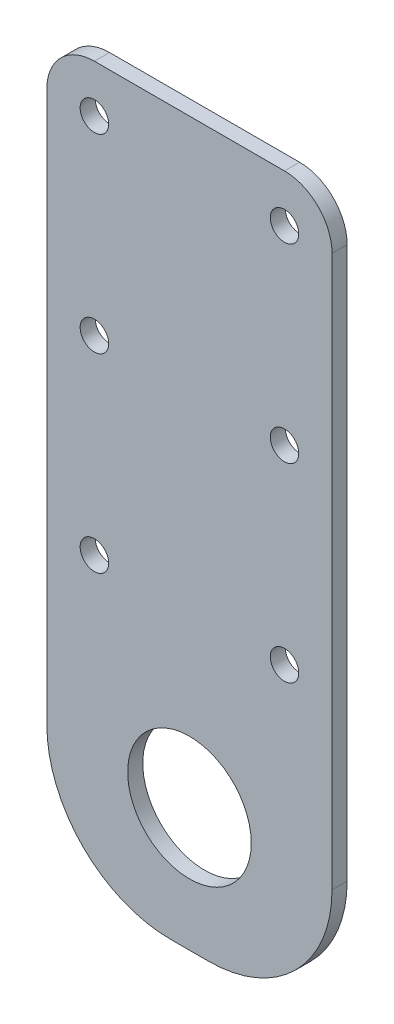
ISO-10303-21;
HEADER;
FILE_DESCRIPTION(('STEP AP214'),'2;1');
FILE_NAME('part.step','',(''),(''),'','','');
FILE_SCHEMA(('AUTOMOTIVE_DESIGN { 1 0 10303 214 1 1 1 1 }'));
ENDSEC;
DATA;
#1=APPLICATION_CONTEXT('core data for automotive mechanical design processes');
#2=APPLICATION_PROTOCOL_DEFINITION('international standard','automotive_design',2000,#1);
#3=PRODUCT_CONTEXT('',#1,'mechanical');
#4=PRODUCT('Part','Part','',(#3));
#5=PRODUCT_RELATED_PRODUCT_CATEGORY('part','',(#4));
#6=PRODUCT_DEFINITION_FORMATION('','',#4);
#7=PRODUCT_DEFINITION_CONTEXT('part definition',#1,'design');
#8=PRODUCT_DEFINITION('design','',#6,#7);
#9=PRODUCT_DEFINITION_SHAPE('','',#8);
#10=(LENGTH_UNIT() NAMED_UNIT(*) SI_UNIT(.MILLI.,.METRE.));
#11=(NAMED_UNIT(*) PLANE_ANGLE_UNIT() SI_UNIT($,.RADIAN.));
#12=(NAMED_UNIT(*) SI_UNIT($,.STERADIAN.) SOLID_ANGLE_UNIT());
#13=UNCERTAINTY_MEASURE_WITH_UNIT(LENGTH_MEASURE(1.E-05),#10,'distance_accuracy_value','');
#14=(GEOMETRIC_REPRESENTATION_CONTEXT(3) GLOBAL_UNCERTAINTY_ASSIGNED_CONTEXT((#13)) GLOBAL_UNIT_ASSIGNED_CONTEXT((#10,
#11,#12)) REPRESENTATION_CONTEXT('',''));
#15=CARTESIAN_POINT('',(0.,0.,0.));
#16=DIRECTION('',(0.,0.,1.));
#17=DIRECTION('',(1.,0.,0.));
#18=AXIS2_PLACEMENT_3D('',#15,#16,#17);
#19=CARTESIAN_POINT('',(0.,0.,1.5875));
#20=DIRECTION('',(0.,0.,1.));
#21=DIRECTION('',(1.,0.,0.));
#22=AXIS2_PLACEMENT_3D('',#19,#20,#21);
#23=PLANE('',#22);
#24=CARTESIAN_POINT('',(25.,25.,1.5875));
#25=DIRECTION('',(0.,0.,1.));
#26=DIRECTION('',(-1.,0.,0.));
#27=AXIS2_PLACEMENT_3D('',#24,#25,#26);
#28=CIRCLE('',#27,1.5);
#29=CARTESIAN_POINT('',(23.5,25.,1.5875));
#30=VERTEX_POINT('',#29);
#31=EDGE_CURVE('E206',#30,#30,#28,.T.);
#32=ORIENTED_EDGE('',*,*,#31,.F.);
#33=EDGE_LOOP('',(#32));
#34=FACE_BOUND('',#33,.T.);
#35=CARTESIAN_POINT('',(5.00000000000001,5.,1.5875));
#36=DIRECTION('',(0.,0.,1.));
#37=DIRECTION('',(1.,0.,0.));
#38=AXIS2_PLACEMENT_3D('',#35,#36,#37);
#39=CIRCLE('',#38,1.5);
#40=CARTESIAN_POINT('',(6.50000000000001,5.,1.5875));
#41=VERTEX_POINT('',#40);
#42=EDGE_CURVE('E194',#41,#41,#39,.T.);
#43=ORIENTED_EDGE('',*,*,#42,.F.);
#44=EDGE_LOOP('',(#43));
#45=FACE_BOUND('',#44,.T.);
#46=CARTESIAN_POINT('',(5.,45.,1.5875));
#47=DIRECTION('',(0.,0.,1.));
#48=DIRECTION('',(1.,0.,0.));
#49=AXIS2_PLACEMENT_3D('',#46,#47,#48);
#50=CIRCLE('',#49,1.5);
#51=CARTESIAN_POINT('',(6.5,45.,1.5875));
#52=VERTEX_POINT('',#51);
#53=EDGE_CURVE('E183',#52,#52,#50,.T.);
#54=ORIENTED_EDGE('',*,*,#53,.F.);
#55=EDGE_LOOP('',(#54));
#56=FACE_BOUND('',#55,.T.);
#57=DIRECTION('',(1.,0.,0.));
#58=VECTOR('',#57,1.);
#59=CARTESIAN_POINT('',(0.,-26.,1.5875));
#60=LINE('',#59,#58);
#61=CARTESIAN_POINT('',(13.,-26.,1.5875));
#62=VERTEX_POINT('',#61);
#63=CARTESIAN_POINT('',(17.,-26.,1.5875));
#64=VERTEX_POINT('',#63);
#65=EDGE_CURVE('E128',#62,#64,#60,.T.);
#66=ORIENTED_EDGE('',*,*,#65,.T.);
#67=CARTESIAN_POINT('',(17.,-13.,1.5875));
#68=DIRECTION('',(0.,0.,1.));
#69=DIRECTION('',(1.,0.,0.));
#70=AXIS2_PLACEMENT_3D('',#67,#68,#69);
#71=CIRCLE('',#70,13.);
#72=CARTESIAN_POINT('',(30.,-13.,1.5875));
#73=VERTEX_POINT('',#72);
#74=EDGE_CURVE('E44',#64,#73,#71,.T.);
#75=ORIENTED_EDGE('',*,*,#74,.T.);
#76=DIRECTION('',(0.,1.,0.));
#77=VECTOR('',#76,1.);
#78=CARTESIAN_POINT('',(30.,-26.,1.5875));
#79=LINE('',#78,#77);
#80=CARTESIAN_POINT('',(30.,45.,1.5875));
#81=VERTEX_POINT('',#80);
#82=EDGE_CURVE('E161',#73,#81,#79,.T.);
#83=ORIENTED_EDGE('',*,*,#82,.T.);
#84=CARTESIAN_POINT('',(25.,45.,1.5875));
#85=DIRECTION('',(0.,0.,1.));
#86=DIRECTION('',(1.,0.,0.));
#87=AXIS2_PLACEMENT_3D('',#84,#85,#86);
#88=CIRCLE('',#87,5.);
#89=CARTESIAN_POINT('',(25.,50.,1.5875));
#90=VERTEX_POINT('',#89);
#91=EDGE_CURVE('E139',#81,#90,#88,.T.);
#92=ORIENTED_EDGE('',*,*,#91,.T.);
#93=DIRECTION('',(-1.,0.,0.));
#94=VECTOR('',#93,1.);
#95=CARTESIAN_POINT('',(0.,50.,1.5875));
#96=LINE('',#95,#94);
#97=CARTESIAN_POINT('',(5.,50.,1.5875));
#98=VERTEX_POINT('',#97);
#99=EDGE_CURVE('E119',#90,#98,#96,.T.);
#100=ORIENTED_EDGE('',*,*,#99,.T.);
#101=CARTESIAN_POINT('',(5.,45.,1.5875));
#102=DIRECTION('',(0.,0.,1.));
#103=DIRECTION('',(1.,0.,0.));
#104=AXIS2_PLACEMENT_3D('',#101,#102,#103);
#105=CIRCLE('',#104,5.);
#106=CARTESIAN_POINT('',(0.,45.,1.5875));
#107=VERTEX_POINT('',#106);
#108=EDGE_CURVE('E141',#98,#107,#105,.T.);
#109=ORIENTED_EDGE('',*,*,#108,.T.);
#110=DIRECTION('',(0.,-1.,0.));
#111=VECTOR('',#110,1.);
#112=CARTESIAN_POINT('',(0.,0.,1.5875));
#113=LINE('',#112,#111);
#114=CARTESIAN_POINT('',(0.,-13.,1.5875));
#115=VERTEX_POINT('',#114);
#116=EDGE_CURVE('E118',#107,#115,#113,.T.);
#117=ORIENTED_EDGE('',*,*,#116,.T.);
#118=CARTESIAN_POINT('',(13.,-13.,1.5875));
#119=DIRECTION('',(0.,0.,1.));
#120=DIRECTION('',(1.,0.,0.));
#121=AXIS2_PLACEMENT_3D('',#118,#119,#120);
#122=CIRCLE('',#121,13.);
#123=EDGE_CURVE('E156',#115,#62,#122,.T.);
#124=ORIENTED_EDGE('',*,*,#123,.T.);
#125=EDGE_LOOP('',(#66,#75,#83,#92,#100,#109,#117,#124));
#126=FACE_BOUND('',#125,.T.);
#127=CARTESIAN_POINT('',(15.,-13.,1.5875));
#128=DIRECTION('',(0.,0.,1.));
#129=DIRECTION('',(1.,0.,0.));
#130=AXIS2_PLACEMENT_3D('',#127,#128,#129);
#131=CIRCLE('',#130,6.50000000000001);
#132=CARTESIAN_POINT('',(21.5,-13.,1.5875));
#133=VERTEX_POINT('',#132);
#134=EDGE_CURVE('E173',#133,#133,#131,.T.);
#135=ORIENTED_EDGE('',*,*,#134,.F.);
#136=EDGE_LOOP('',(#135));
#137=FACE_BOUND('',#136,.T.);
#138=CARTESIAN_POINT('',(5.,25.,1.5875));
#139=DIRECTION('',(0.,0.,1.));
#140=DIRECTION('',(1.,0.,0.));
#141=AXIS2_PLACEMENT_3D('',#138,#139,#140);
#142=CIRCLE('',#141,1.5);
#143=CARTESIAN_POINT('',(6.5,25.,1.5875));
#144=VERTEX_POINT('',#143);
#145=EDGE_CURVE('E188',#144,#144,#142,.T.);
#146=ORIENTED_EDGE('',*,*,#145,.F.);
#147=EDGE_LOOP('',(#146));
#148=FACE_BOUND('',#147,.T.);
#149=CARTESIAN_POINT('',(25.,5.,1.5875));
#150=DIRECTION('',(0.,0.,1.));
#151=DIRECTION('',(-1.,0.,0.));
#152=AXIS2_PLACEMENT_3D('',#149,#150,#151);
#153=CIRCLE('',#152,1.5);
#154=CARTESIAN_POINT('',(23.5,5.,1.5875));
#155=VERTEX_POINT('',#154);
#156=EDGE_CURVE('E200',#155,#155,#153,.T.);
#157=ORIENTED_EDGE('',*,*,#156,.F.);
#158=EDGE_LOOP('',(#157));
#159=FACE_BOUND('',#158,.T.);
#160=CARTESIAN_POINT('',(25.,45.,1.5875));
#161=DIRECTION('',(0.,0.,1.));
#162=DIRECTION('',(-1.,0.,0.));
#163=AXIS2_PLACEMENT_3D('',#160,#161,#162);
#164=CIRCLE('',#163,1.5);
#165=CARTESIAN_POINT('',(23.5,45.,1.5875));
#166=VERTEX_POINT('',#165);
#167=EDGE_CURVE('E212',#166,#166,#164,.T.);
#168=ORIENTED_EDGE('',*,*,#167,.F.);
#169=EDGE_LOOP('',(#168));
#170=FACE_BOUND('',#169,.T.);
#171=ADVANCED_FACE('F36',(#34,#45,#56,#126,#137,#148,#159,#170),#23,.T.);
#172=CARTESIAN_POINT('',(0.,0.,0.));
#173=DIRECTION('',(0.,0.,1.));
#174=DIRECTION('',(1.,0.,0.));
#175=AXIS2_PLACEMENT_3D('',#172,#173,#174);
#176=PLANE('',#175);
#177=DIRECTION('',(0.,1.,0.));
#178=VECTOR('',#177,1.);
#179=CARTESIAN_POINT('',(30.,50.,0.));
#180=LINE('',#179,#178);
#181=CARTESIAN_POINT('',(30.,-13.,0.));
#182=VERTEX_POINT('',#181);
#183=CARTESIAN_POINT('',(30.,45.,0.));
#184=VERTEX_POINT('',#183);
#185=EDGE_CURVE('E130',#182,#184,#180,.T.);
#186=ORIENTED_EDGE('',*,*,#185,.F.);
#187=CARTESIAN_POINT('',(17.,-13.,0.));
#188=DIRECTION('',(0.,0.,1.));
#189=DIRECTION('',(1.,0.,0.));
#190=AXIS2_PLACEMENT_3D('',#187,#188,#189);
#191=CIRCLE('',#190,13.);
#192=CARTESIAN_POINT('',(17.,-26.,0.));
#193=VERTEX_POINT('',#192);
#194=EDGE_CURVE('E150',#182,#193,#191,.F.);
#195=ORIENTED_EDGE('',*,*,#194,.T.);
#196=DIRECTION('',(1.,0.,0.));
#197=VECTOR('',#196,1.);
#198=CARTESIAN_POINT('',(0.,-26.,0.));
#199=LINE('',#198,#197);
#200=CARTESIAN_POINT('',(13.,-26.,0.));
#201=VERTEX_POINT('',#200);
#202=EDGE_CURVE('E170',#201,#193,#199,.T.);
#203=ORIENTED_EDGE('',*,*,#202,.F.);
#204=CARTESIAN_POINT('',(13.,-13.,0.));
#205=DIRECTION('',(0.,0.,1.));
#206=DIRECTION('',(1.,0.,0.));
#207=AXIS2_PLACEMENT_3D('',#204,#205,#206);
#208=CIRCLE('',#207,13.);
#209=CARTESIAN_POINT('',(0.,-13.,0.));
#210=VERTEX_POINT('',#209);
#211=EDGE_CURVE('E125',#201,#210,#208,.F.);
#212=ORIENTED_EDGE('',*,*,#211,.T.);
#213=DIRECTION('',(0.,-1.,0.));
#214=VECTOR('',#213,1.);
#215=CARTESIAN_POINT('',(0.,0.,0.));
#216=LINE('',#215,#214);
#217=CARTESIAN_POINT('',(0.,45.,0.));
#218=VERTEX_POINT('',#217);
#219=EDGE_CURVE('E117',#218,#210,#216,.T.);
#220=ORIENTED_EDGE('',*,*,#219,.F.);
#221=CARTESIAN_POINT('',(5.,45.,0.));
#222=DIRECTION('',(0.,0.,1.));
#223=DIRECTION('',(1.,0.,0.));
#224=AXIS2_PLACEMENT_3D('',#221,#222,#223);
#225=CIRCLE('',#224,5.);
#226=CARTESIAN_POINT('',(5.,50.,0.));
#227=VERTEX_POINT('',#226);
#228=EDGE_CURVE('E103',#218,#227,#225,.F.);
#229=ORIENTED_EDGE('',*,*,#228,.T.);
#230=DIRECTION('',(-1.,0.,0.));
#231=VECTOR('',#230,1.);
#232=CARTESIAN_POINT('',(0.,50.,0.));
#233=LINE('',#232,#231);
#234=CARTESIAN_POINT('',(25.,50.,0.));
#235=VERTEX_POINT('',#234);
#236=EDGE_CURVE('E126',#235,#227,#233,.T.);
#237=ORIENTED_EDGE('',*,*,#236,.F.);
#238=CARTESIAN_POINT('',(25.,45.,0.));
#239=DIRECTION('',(0.,0.,1.));
#240=DIRECTION('',(1.,0.,0.));
#241=AXIS2_PLACEMENT_3D('',#238,#239,#240);
#242=CIRCLE('',#241,5.);
#243=EDGE_CURVE('E114',#235,#184,#242,.F.);
#244=ORIENTED_EDGE('',*,*,#243,.T.);
#245=EDGE_LOOP('',(#186,#195,#203,#212,#220,#229,#237,#244));
#246=FACE_BOUND('',#245,.T.);
#247=CARTESIAN_POINT('',(15.,-13.,0.));
#248=DIRECTION('',(0.,0.,1.));
#249=DIRECTION('',(1.,0.,0.));
#250=AXIS2_PLACEMENT_3D('',#247,#248,#249);
#251=CIRCLE('',#250,6.50000000000001);
#252=CARTESIAN_POINT('',(21.5,-13.,0.));
#253=VERTEX_POINT('',#252);
#254=EDGE_CURVE('E176',#253,#253,#251,.T.);
#255=ORIENTED_EDGE('',*,*,#254,.T.);
#256=EDGE_LOOP('',(#255));
#257=FACE_BOUND('',#256,.T.);
#258=CARTESIAN_POINT('',(5.,45.,0.));
#259=DIRECTION('',(0.,0.,1.));
#260=DIRECTION('',(1.,0.,0.));
#261=AXIS2_PLACEMENT_3D('',#258,#259,#260);
#262=CIRCLE('',#261,1.5);
#263=CARTESIAN_POINT('',(6.5,45.,0.));
#264=VERTEX_POINT('',#263);
#265=EDGE_CURVE('E185',#264,#264,#262,.T.);
#266=ORIENTED_EDGE('',*,*,#265,.T.);
#267=EDGE_LOOP('',(#266));
#268=FACE_BOUND('',#267,.T.);
#269=CARTESIAN_POINT('',(5.,25.,0.));
#270=DIRECTION('',(0.,0.,1.));
#271=DIRECTION('',(1.,0.,0.));
#272=AXIS2_PLACEMENT_3D('',#269,#270,#271);
#273=CIRCLE('',#272,1.5);
#274=CARTESIAN_POINT('',(6.5,25.,0.));
#275=VERTEX_POINT('',#274);
#276=EDGE_CURVE('E191',#275,#275,#273,.T.);
#277=ORIENTED_EDGE('',*,*,#276,.T.);
#278=EDGE_LOOP('',(#277));
#279=FACE_BOUND('',#278,.T.);
#280=CARTESIAN_POINT('',(5.00000000000001,5.,0.));
#281=DIRECTION('',(0.,0.,1.));
#282=DIRECTION('',(1.,0.,0.));
#283=AXIS2_PLACEMENT_3D('',#280,#281,#282);
#284=CIRCLE('',#283,1.5);
#285=CARTESIAN_POINT('',(6.50000000000001,5.,0.));
#286=VERTEX_POINT('',#285);
#287=EDGE_CURVE('E197',#286,#286,#284,.T.);
#288=ORIENTED_EDGE('',*,*,#287,.T.);
#289=EDGE_LOOP('',(#288));
#290=FACE_BOUND('',#289,.T.);
#291=CARTESIAN_POINT('',(25.,5.,0.));
#292=DIRECTION('',(0.,0.,1.));
#293=DIRECTION('',(-1.,0.,0.));
#294=AXIS2_PLACEMENT_3D('',#291,#292,#293);
#295=CIRCLE('',#294,1.5);
#296=CARTESIAN_POINT('',(23.5,5.,0.));
#297=VERTEX_POINT('',#296);
#298=EDGE_CURVE('E203',#297,#297,#295,.T.);
#299=ORIENTED_EDGE('',*,*,#298,.T.);
#300=EDGE_LOOP('',(#299));
#301=FACE_BOUND('',#300,.T.);
#302=CARTESIAN_POINT('',(25.,25.,0.));
#303=DIRECTION('',(0.,0.,1.));
#304=DIRECTION('',(-1.,0.,0.));
#305=AXIS2_PLACEMENT_3D('',#302,#303,#304);
#306=CIRCLE('',#305,1.5);
#307=CARTESIAN_POINT('',(23.5,25.,0.));
#308=VERTEX_POINT('',#307);
#309=EDGE_CURVE('E209',#308,#308,#306,.T.);
#310=ORIENTED_EDGE('',*,*,#309,.T.);
#311=EDGE_LOOP('',(#310));
#312=FACE_BOUND('',#311,.T.);
#313=CARTESIAN_POINT('',(25.,45.,0.));
#314=DIRECTION('',(0.,0.,1.));
#315=DIRECTION('',(-1.,0.,0.));
#316=AXIS2_PLACEMENT_3D('',#313,#314,#315);
#317=CIRCLE('',#316,1.5);
#318=CARTESIAN_POINT('',(23.5,45.,0.));
#319=VERTEX_POINT('',#318);
#320=EDGE_CURVE('E215',#319,#319,#317,.T.);
#321=ORIENTED_EDGE('',*,*,#320,.T.);
#322=EDGE_LOOP('',(#321));
#323=FACE_BOUND('',#322,.T.);
#324=ADVANCED_FACE('F122',(#246,#257,#268,#279,#290,#301,#312,#323),#176,.F.);
#325=CARTESIAN_POINT('',(0.,-26.,1.5875));
#326=DIRECTION('',(0.,1.,0.));
#327=DIRECTION('',(0.,0.,1.));
#328=AXIS2_PLACEMENT_3D('',#325,#326,#327);
#329=PLANE('',#328);
#330=ORIENTED_EDGE('',*,*,#202,.T.);
#331=DIRECTION('',(0.,0.,-1.));
#332=VECTOR('',#331,1.);
#333=CARTESIAN_POINT('',(17.,-26.,1.5875));
#334=LINE('',#333,#332);
#335=EDGE_CURVE('E57',#193,#64,#334,.F.);
#336=ORIENTED_EDGE('',*,*,#335,.T.);
#337=ORIENTED_EDGE('',*,*,#65,.F.);
#338=DIRECTION('',(0.,0.,-1.));
#339=VECTOR('',#338,1.);
#340=CARTESIAN_POINT('',(13.,-26.,1.5875));
#341=LINE('',#340,#339);
#342=EDGE_CURVE('E152',#62,#201,#341,.T.);
#343=ORIENTED_EDGE('',*,*,#342,.T.);
#344=EDGE_LOOP('',(#330,#336,#337,#343));
#345=FACE_BOUND('',#344,.T.);
#346=ADVANCED_FACE('F171',(#345),#329,.F.);
#347=CARTESIAN_POINT('',(30.,50.,1.5875));
#348=DIRECTION('',(-1.,0.,0.));
#349=DIRECTION('',(0.,0.,1.));
#350=AXIS2_PLACEMENT_3D('',#347,#348,#349);
#351=PLANE('',#350);
#352=ORIENTED_EDGE('',*,*,#82,.F.);
#353=DIRECTION('',(0.,0.,-1.));
#354=VECTOR('',#353,1.);
#355=CARTESIAN_POINT('',(30.,-13.,1.5875));
#356=LINE('',#355,#354);
#357=EDGE_CURVE('E146',#73,#182,#356,.T.);
#358=ORIENTED_EDGE('',*,*,#357,.T.);
#359=ORIENTED_EDGE('',*,*,#185,.T.);
#360=DIRECTION('',(0.,0.,-1.));
#361=VECTOR('',#360,1.);
#362=CARTESIAN_POINT('',(30.,45.,1.5875));
#363=LINE('',#362,#361);
#364=EDGE_CURVE('E143',#184,#81,#363,.F.);
#365=ORIENTED_EDGE('',*,*,#364,.T.);
#366=EDGE_LOOP('',(#352,#358,#359,#365));
#367=FACE_BOUND('',#366,.T.);
#368=ADVANCED_FACE('F165',(#367),#351,.F.);
#369=CARTESIAN_POINT('',(0.,50.,1.5875));
#370=DIRECTION('',(0.,-1.,0.));
#371=DIRECTION('',(0.,0.,-1.));
#372=AXIS2_PLACEMENT_3D('',#369,#370,#371);
#373=PLANE('',#372);
#374=ORIENTED_EDGE('',*,*,#236,.T.);
#375=DIRECTION('',(0.,0.,-1.));
#376=VECTOR('',#375,1.);
#377=CARTESIAN_POINT('',(5.,50.,1.5875));
#378=LINE('',#377,#376);
#379=EDGE_CURVE('E108',#227,#98,#378,.F.);
#380=ORIENTED_EDGE('',*,*,#379,.T.);
#381=ORIENTED_EDGE('',*,*,#99,.F.);
#382=DIRECTION('',(0.,0.,-1.));
#383=VECTOR('',#382,1.);
#384=CARTESIAN_POINT('',(25.,50.,1.5875));
#385=LINE('',#384,#383);
#386=EDGE_CURVE('E113',#90,#235,#385,.T.);
#387=ORIENTED_EDGE('',*,*,#386,.T.);
#388=EDGE_LOOP('',(#374,#380,#381,#387));
#389=FACE_BOUND('',#388,.T.);
#390=ADVANCED_FACE('F239',(#389),#373,.F.);
#391=CARTESIAN_POINT('',(0.,0.,1.5875));
#392=DIRECTION('',(1.,0.,0.));
#393=DIRECTION('',(0.,0.,-1.));
#394=AXIS2_PLACEMENT_3D('',#391,#392,#393);
#395=PLANE('',#394);
#396=ORIENTED_EDGE('',*,*,#219,.T.);
#397=DIRECTION('',(0.,0.,-1.));
#398=VECTOR('',#397,1.);
#399=CARTESIAN_POINT('',(0.,-13.,1.5875));
#400=LINE('',#399,#398);
#401=EDGE_CURVE('E11',#210,#115,#400,.F.);
#402=ORIENTED_EDGE('',*,*,#401,.T.);
#403=ORIENTED_EDGE('',*,*,#116,.F.);
#404=DIRECTION('',(0.,0.,-1.));
#405=VECTOR('',#404,1.);
#406=CARTESIAN_POINT('',(0.,45.,1.5875));
#407=LINE('',#406,#405);
#408=EDGE_CURVE('E107',#107,#218,#407,.T.);
#409=ORIENTED_EDGE('',*,*,#408,.T.);
#410=EDGE_LOOP('',(#396,#402,#403,#409));
#411=FACE_BOUND('',#410,.T.);
#412=ADVANCED_FACE('F116',(#411),#395,.F.);
#413=CARTESIAN_POINT('',(15.,-13.,1.5875));
#414=DIRECTION('',(0.,0.,-1.));
#415=DIRECTION('',(-1.,0.,0.));
#416=AXIS2_PLACEMENT_3D('',#413,#414,#415);
#417=CYLINDRICAL_SURFACE('',#416,6.50000000000001);
#418=ORIENTED_EDGE('',*,*,#134,.T.);
#419=EDGE_LOOP('',(#418));
#420=FACE_BOUND('',#419,.T.);
#421=ORIENTED_EDGE('',*,*,#254,.F.);
#422=EDGE_LOOP('',(#421));
#423=FACE_BOUND('',#422,.T.);
#424=ADVANCED_FACE('F234',(#420,#423),#417,.F.);
#425=CARTESIAN_POINT('',(5.,45.,1.5875));
#426=DIRECTION('',(0.,0.,-1.));
#427=DIRECTION('',(-1.,0.,0.));
#428=AXIS2_PLACEMENT_3D('',#425,#426,#427);
#429=CYLINDRICAL_SURFACE('',#428,1.5);
#430=ORIENTED_EDGE('',*,*,#53,.T.);
#431=EDGE_LOOP('',(#430));
#432=FACE_BOUND('',#431,.T.);
#433=ORIENTED_EDGE('',*,*,#265,.F.);
#434=EDGE_LOOP('',(#433));
#435=FACE_BOUND('',#434,.T.);
#436=ADVANCED_FACE('F364',(#432,#435),#429,.F.);
#437=CARTESIAN_POINT('',(5.,25.,1.5875));
#438=DIRECTION('',(0.,0.,-1.));
#439=DIRECTION('',(-1.,0.,0.));
#440=AXIS2_PLACEMENT_3D('',#437,#438,#439);
#441=CYLINDRICAL_SURFACE('',#440,1.5);
#442=ORIENTED_EDGE('',*,*,#145,.T.);
#443=EDGE_LOOP('',(#442));
#444=FACE_BOUND('',#443,.T.);
#445=ORIENTED_EDGE('',*,*,#276,.F.);
#446=EDGE_LOOP('',(#445));
#447=FACE_BOUND('',#446,.T.);
#448=ADVANCED_FACE('F354',(#444,#447),#441,.F.);
#449=CARTESIAN_POINT('',(5.00000000000001,5.,1.5875));
#450=DIRECTION('',(0.,0.,-1.));
#451=DIRECTION('',(-1.,0.,0.));
#452=AXIS2_PLACEMENT_3D('',#449,#450,#451);
#453=CYLINDRICAL_SURFACE('',#452,1.5);
#454=ORIENTED_EDGE('',*,*,#42,.T.);
#455=EDGE_LOOP('',(#454));
#456=FACE_BOUND('',#455,.T.);
#457=ORIENTED_EDGE('',*,*,#287,.F.);
#458=EDGE_LOOP('',(#457));
#459=FACE_BOUND('',#458,.T.);
#460=ADVANCED_FACE('F344',(#456,#459),#453,.F.);
#461=CARTESIAN_POINT('',(25.,5.,1.5875));
#462=DIRECTION('',(0.,0.,-1.));
#463=DIRECTION('',(-1.,0.,0.));
#464=AXIS2_PLACEMENT_3D('',#461,#462,#463);
#465=CYLINDRICAL_SURFACE('',#464,1.5);
#466=ORIENTED_EDGE('',*,*,#156,.T.);
#467=EDGE_LOOP('',(#466));
#468=FACE_BOUND('',#467,.T.);
#469=ORIENTED_EDGE('',*,*,#298,.F.);
#470=EDGE_LOOP('',(#469));
#471=FACE_BOUND('',#470,.T.);
#472=ADVANCED_FACE('F334',(#468,#471),#465,.F.);
#473=CARTESIAN_POINT('',(25.,25.,1.5875));
#474=DIRECTION('',(0.,0.,-1.));
#475=DIRECTION('',(-1.,0.,0.));
#476=AXIS2_PLACEMENT_3D('',#473,#474,#475);
#477=CYLINDRICAL_SURFACE('',#476,1.5);
#478=ORIENTED_EDGE('',*,*,#31,.T.);
#479=EDGE_LOOP('',(#478));
#480=FACE_BOUND('',#479,.T.);
#481=ORIENTED_EDGE('',*,*,#309,.F.);
#482=EDGE_LOOP('',(#481));
#483=FACE_BOUND('',#482,.T.);
#484=ADVANCED_FACE('F325',(#480,#483),#477,.F.);
#485=CARTESIAN_POINT('',(25.,45.,1.5875));
#486=DIRECTION('',(0.,0.,-1.));
#487=DIRECTION('',(-1.,0.,0.));
#488=AXIS2_PLACEMENT_3D('',#485,#486,#487);
#489=CYLINDRICAL_SURFACE('',#488,1.5);
#490=ORIENTED_EDGE('',*,*,#167,.T.);
#491=EDGE_LOOP('',(#490));
#492=FACE_BOUND('',#491,.T.);
#493=ORIENTED_EDGE('',*,*,#320,.F.);
#494=EDGE_LOOP('',(#493));
#495=FACE_BOUND('',#494,.T.);
#496=ADVANCED_FACE('F221',(#492,#495),#489,.F.);
#497=CARTESIAN_POINT('',(5.,45.,1.5875));
#498=DIRECTION('',(0.,0.,-1.));
#499=DIRECTION('',(-1.,0.,0.));
#500=AXIS2_PLACEMENT_3D('',#497,#498,#499);
#501=CYLINDRICAL_SURFACE('',#500,5.);
#502=ORIENTED_EDGE('',*,*,#108,.F.);
#503=ORIENTED_EDGE('',*,*,#379,.F.);
#504=ORIENTED_EDGE('',*,*,#228,.F.);
#505=ORIENTED_EDGE('',*,*,#408,.F.);
#506=EDGE_LOOP('',(#502,#503,#504,#505));
#507=FACE_BOUND('',#506,.T.);
#508=ADVANCED_FACE('F106',(#507),#501,.T.);
#509=CARTESIAN_POINT('',(25.,45.,1.5875));
#510=DIRECTION('',(0.,0.,-1.));
#511=DIRECTION('',(-1.,0.,0.));
#512=AXIS2_PLACEMENT_3D('',#509,#510,#511);
#513=CYLINDRICAL_SURFACE('',#512,5.);
#514=ORIENTED_EDGE('',*,*,#91,.F.);
#515=ORIENTED_EDGE('',*,*,#364,.F.);
#516=ORIENTED_EDGE('',*,*,#243,.F.);
#517=ORIENTED_EDGE('',*,*,#386,.F.);
#518=EDGE_LOOP('',(#514,#515,#516,#517));
#519=FACE_BOUND('',#518,.T.);
#520=ADVANCED_FACE('F249',(#519),#513,.T.);
#521=CARTESIAN_POINT('',(17.,-13.,1.5875));
#522=DIRECTION('',(0.,0.,-1.));
#523=DIRECTION('',(-1.,0.,0.));
#524=AXIS2_PLACEMENT_3D('',#521,#522,#523);
#525=CYLINDRICAL_SURFACE('',#524,13.);
#526=ORIENTED_EDGE('',*,*,#74,.F.);
#527=ORIENTED_EDGE('',*,*,#335,.F.);
#528=ORIENTED_EDGE('',*,*,#194,.F.);
#529=ORIENTED_EDGE('',*,*,#357,.F.);
#530=EDGE_LOOP('',(#526,#527,#528,#529));
#531=FACE_BOUND('',#530,.T.);
#532=ADVANCED_FACE('F169',(#531),#525,.T.);
#533=CARTESIAN_POINT('',(13.,-13.,1.5875));
#534=DIRECTION('',(0.,0.,-1.));
#535=DIRECTION('',(-1.,0.,0.));
#536=AXIS2_PLACEMENT_3D('',#533,#534,#535);
#537=CYLINDRICAL_SURFACE('',#536,13.);
#538=ORIENTED_EDGE('',*,*,#123,.F.);
#539=ORIENTED_EDGE('',*,*,#401,.F.);
#540=ORIENTED_EDGE('',*,*,#211,.F.);
#541=ORIENTED_EDGE('',*,*,#342,.F.);
#542=EDGE_LOOP('',(#538,#539,#540,#541));
#543=FACE_BOUND('',#542,.T.);
#544=ADVANCED_FACE('F38',(#543),#537,.T.);
#545=CLOSED_SHELL('',(#171,#324,#346,#368,#390,#412,#424,#436,#448,#460,#472,#484,#496,#508,
#520,#532,#544));
#546=MANIFOLD_SOLID_BREP('B2',#545);
#547=ADVANCED_BREP_SHAPE_REPRESENTATION('',(#18,#546),#14);
#548=SHAPE_DEFINITION_REPRESENTATION(#9,#547);
ENDSEC;
END-ISO-10303-21;
